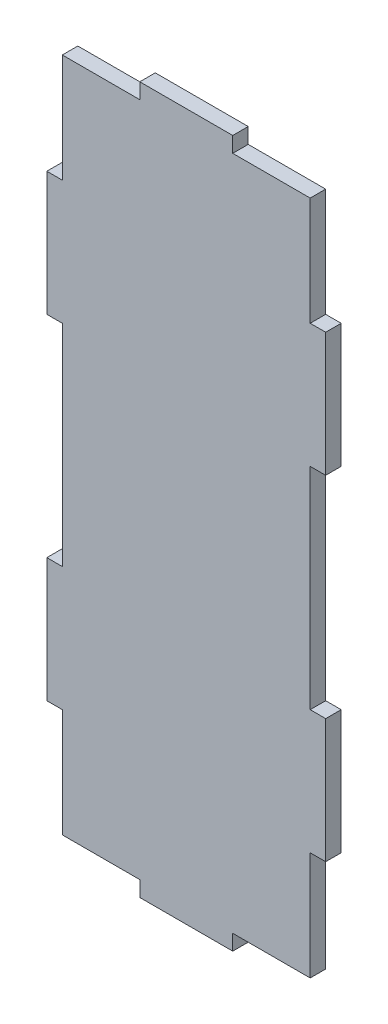
ISO-10303-21;
HEADER;
FILE_DESCRIPTION(('STEP AP214'),'2;1');
FILE_NAME('part.step','',(''),(''),'','','');
FILE_SCHEMA(('AUTOMOTIVE_DESIGN { 1 0 10303 214 1 1 1 1 }'));
ENDSEC;
DATA;
#1=APPLICATION_CONTEXT('core data for automotive mechanical design processes');
#2=APPLICATION_PROTOCOL_DEFINITION('international standard','automotive_design',2000,#1);
#3=PRODUCT_CONTEXT('',#1,'mechanical');
#4=PRODUCT('Part','Part','',(#3));
#5=PRODUCT_RELATED_PRODUCT_CATEGORY('part','',(#4));
#6=PRODUCT_DEFINITION_FORMATION('','',#4);
#7=PRODUCT_DEFINITION_CONTEXT('part definition',#1,'design');
#8=PRODUCT_DEFINITION('design','',#6,#7);
#9=PRODUCT_DEFINITION_SHAPE('','',#8);
#10=(LENGTH_UNIT() NAMED_UNIT(*) SI_UNIT(.MILLI.,.METRE.));
#11=(NAMED_UNIT(*) PLANE_ANGLE_UNIT() SI_UNIT($,.RADIAN.));
#12=(NAMED_UNIT(*) SI_UNIT($,.STERADIAN.) SOLID_ANGLE_UNIT());
#13=UNCERTAINTY_MEASURE_WITH_UNIT(LENGTH_MEASURE(1.E-05),#10,'distance_accuracy_value','');
#14=(GEOMETRIC_REPRESENTATION_CONTEXT(3) GLOBAL_UNCERTAINTY_ASSIGNED_CONTEXT((#13)) GLOBAL_UNIT_ASSIGNED_CONTEXT((#10,
#11,#12)) REPRESENTATION_CONTEXT('',''));
#15=CARTESIAN_POINT('',(0.,0.,0.));
#16=DIRECTION('',(0.,0.,1.));
#17=DIRECTION('',(1.,0.,0.));
#18=AXIS2_PLACEMENT_3D('',#15,#16,#17);
#19=CARTESIAN_POINT('',(0.,0.,3.175));
#20=DIRECTION('',(1.,0.,0.));
#21=DIRECTION('',(0.,0.,-1.));
#22=AXIS2_PLACEMENT_3D('',#19,#20,#21);
#23=PLANE('',#22);
#24=DIRECTION('',(0.,-1.,0.));
#25=VECTOR('',#24,1.);
#26=CARTESIAN_POINT('',(0.,0.,0.));
#27=LINE('',#26,#25);
#28=CARTESIAN_POINT('',(0.,22.225,0.));
#29=VERTEX_POINT('',#28);
#30=CARTESIAN_POINT('',(0.,0.,0.));
#31=VERTEX_POINT('',#30);
#32=EDGE_CURVE('E249',#29,#31,#27,.T.);
#33=ORIENTED_EDGE('',*,*,#32,.T.);
#34=DIRECTION('',(0.,0.,-1.));
#35=VECTOR('',#34,1.);
#36=CARTESIAN_POINT('',(0.,0.,3.175));
#37=LINE('',#36,#35);
#38=CARTESIAN_POINT('',(0.,0.,3.175));
#39=VERTEX_POINT('',#38);
#40=EDGE_CURVE('E11',#39,#31,#37,.T.);
#41=ORIENTED_EDGE('',*,*,#40,.F.);
#42=DIRECTION('',(0.,-1.,0.));
#43=VECTOR('',#42,1.);
#44=CARTESIAN_POINT('',(0.,0.,3.175));
#45=LINE('',#44,#43);
#46=CARTESIAN_POINT('',(0.,22.225,3.175));
#47=VERTEX_POINT('',#46);
#48=EDGE_CURVE('E303',#47,#39,#45,.T.);
#49=ORIENTED_EDGE('',*,*,#48,.F.);
#50=DIRECTION('',(0.,0.,-1.));
#51=VECTOR('',#50,1.);
#52=CARTESIAN_POINT('',(0.,22.225,3.175));
#53=LINE('',#52,#51);
#54=EDGE_CURVE('E245',#47,#29,#53,.T.);
#55=ORIENTED_EDGE('',*,*,#54,.T.);
#56=EDGE_LOOP('',(#33,#41,#49,#55));
#57=FACE_BOUND('',#56,.T.);
#58=ADVANCED_FACE('F33',(#57),#23,.F.);
#59=CARTESIAN_POINT('',(0.,0.,3.175));
#60=DIRECTION('',(0.,1.,0.));
#61=DIRECTION('',(-1.,0.,0.));
#62=AXIS2_PLACEMENT_3D('',#59,#60,#61);
#63=PLANE('',#62);
#64=DIRECTION('',(1.,0.,0.));
#65=VECTOR('',#64,1.);
#66=CARTESIAN_POINT('',(0.,0.,0.));
#67=LINE('',#66,#65);
#68=CARTESIAN_POINT('',(15.8750000000001,0.,0.));
#69=VERTEX_POINT('',#68);
#70=EDGE_CURVE('E252',#31,#69,#67,.T.);
#71=ORIENTED_EDGE('',*,*,#70,.T.);
#72=DIRECTION('',(0.,0.,-1.));
#73=VECTOR('',#72,1.);
#74=CARTESIAN_POINT('',(15.8750000000001,0.,3.175));
#75=LINE('',#74,#73);
#76=CARTESIAN_POINT('',(15.8750000000001,0.,3.175));
#77=VERTEX_POINT('',#76);
#78=EDGE_CURVE('E41',#77,#69,#75,.T.);
#79=ORIENTED_EDGE('',*,*,#78,.F.);
#80=DIRECTION('',(1.,0.,0.));
#81=VECTOR('',#80,1.);
#82=CARTESIAN_POINT('',(0.,0.,3.175));
#83=LINE('',#82,#81);
#84=EDGE_CURVE('E152',#39,#77,#83,.T.);
#85=ORIENTED_EDGE('',*,*,#84,.F.);
#86=ORIENTED_EDGE('',*,*,#40,.T.);
#87=EDGE_LOOP('',(#71,#79,#85,#86));
#88=FACE_BOUND('',#87,.T.);
#89=ADVANCED_FACE('F461',(#88),#63,.F.);
#90=CARTESIAN_POINT('',(15.8750000000001,0.,3.175));
#91=DIRECTION('',(1.,0.,0.));
#92=DIRECTION('',(0.,0.,-1.));
#93=AXIS2_PLACEMENT_3D('',#90,#91,#92);
#94=PLANE('',#93);
#95=DIRECTION('',(0.,-1.,0.));
#96=VECTOR('',#95,1.);
#97=CARTESIAN_POINT('',(15.8750000000001,0.,0.));
#98=LINE('',#97,#96);
#99=CARTESIAN_POINT('',(15.8750000000001,-3.17500000000004,0.));
#100=VERTEX_POINT('',#99);
#101=EDGE_CURVE('E254',#69,#100,#98,.T.);
#102=ORIENTED_EDGE('',*,*,#101,.T.);
#103=DIRECTION('',(0.,0.,-1.));
#104=VECTOR('',#103,1.);
#105=CARTESIAN_POINT('',(15.8750000000001,-3.17500000000004,3.175));
#106=LINE('',#105,#104);
#107=CARTESIAN_POINT('',(15.8750000000001,-3.17500000000004,3.175));
#108=VERTEX_POINT('',#107);
#109=EDGE_CURVE('E370',#108,#100,#106,.T.);
#110=ORIENTED_EDGE('',*,*,#109,.F.);
#111=DIRECTION('',(0.,-1.,0.));
#112=VECTOR('',#111,1.);
#113=CARTESIAN_POINT('',(15.8750000000001,0.,3.175));
#114=LINE('',#113,#112);
#115=EDGE_CURVE('E378',#77,#108,#114,.T.);
#116=ORIENTED_EDGE('',*,*,#115,.F.);
#117=ORIENTED_EDGE('',*,*,#78,.T.);
#118=EDGE_LOOP('',(#102,#110,#116,#117));
#119=FACE_BOUND('',#118,.T.);
#120=ADVANCED_FACE('F376',(#119),#94,.F.);
#121=CARTESIAN_POINT('',(15.8750000000001,-3.17500000000004,3.175));
#122=DIRECTION('',(0.,1.,0.));
#123=DIRECTION('',(-1.,0.,0.));
#124=AXIS2_PLACEMENT_3D('',#121,#122,#123);
#125=PLANE('',#124);
#126=DIRECTION('',(1.,0.,0.));
#127=VECTOR('',#126,1.);
#128=CARTESIAN_POINT('',(15.8750000000001,-3.17500000000004,0.));
#129=LINE('',#128,#127);
#130=CARTESIAN_POINT('',(34.9250000000001,-3.17500000000001,0.));
#131=VERTEX_POINT('',#130);
#132=EDGE_CURVE('E256',#100,#131,#129,.T.);
#133=ORIENTED_EDGE('',*,*,#132,.T.);
#134=DIRECTION('',(0.,0.,-1.));
#135=VECTOR('',#134,1.);
#136=CARTESIAN_POINT('',(34.9250000000001,-3.17500000000001,3.175));
#137=LINE('',#136,#135);
#138=CARTESIAN_POINT('',(34.9250000000001,-3.17500000000001,3.175));
#139=VERTEX_POINT('',#138);
#140=EDGE_CURVE('E367',#139,#131,#137,.T.);
#141=ORIENTED_EDGE('',*,*,#140,.F.);
#142=DIRECTION('',(1.,0.,0.));
#143=VECTOR('',#142,1.);
#144=CARTESIAN_POINT('',(15.8750000000001,-3.17500000000004,3.175));
#145=LINE('',#144,#143);
#146=EDGE_CURVE('E396',#108,#139,#145,.T.);
#147=ORIENTED_EDGE('',*,*,#146,.F.);
#148=ORIENTED_EDGE('',*,*,#109,.T.);
#149=EDGE_LOOP('',(#133,#141,#147,#148));
#150=FACE_BOUND('',#149,.T.);
#151=ADVANCED_FACE('F387',(#150),#125,.F.);
#152=CARTESIAN_POINT('',(34.9250000000001,-3.17500000000001,3.175));
#153=DIRECTION('',(-1.,0.,0.));
#154=DIRECTION('',(0.,0.,1.));
#155=AXIS2_PLACEMENT_3D('',#152,#153,#154);
#156=PLANE('',#155);
#157=DIRECTION('',(0.,1.,0.));
#158=VECTOR('',#157,1.);
#159=CARTESIAN_POINT('',(34.9250000000001,-3.17500000000001,0.));
#160=LINE('',#159,#158);
#161=CARTESIAN_POINT('',(34.9250000000001,0.,0.));
#162=VERTEX_POINT('',#161);
#163=EDGE_CURVE('E258',#131,#162,#160,.T.);
#164=ORIENTED_EDGE('',*,*,#163,.T.);
#165=DIRECTION('',(0.,0.,-1.));
#166=VECTOR('',#165,1.);
#167=CARTESIAN_POINT('',(34.9250000000001,0.,3.175));
#168=LINE('',#167,#166);
#169=CARTESIAN_POINT('',(34.9250000000001,0.,3.175));
#170=VERTEX_POINT('',#169);
#171=EDGE_CURVE('E364',#170,#162,#168,.T.);
#172=ORIENTED_EDGE('',*,*,#171,.F.);
#173=DIRECTION('',(0.,1.,0.));
#174=VECTOR('',#173,1.);
#175=CARTESIAN_POINT('',(34.9250000000001,-3.17500000000001,3.175));
#176=LINE('',#175,#174);
#177=EDGE_CURVE('E393',#139,#170,#176,.T.);
#178=ORIENTED_EDGE('',*,*,#177,.F.);
#179=ORIENTED_EDGE('',*,*,#140,.T.);
#180=EDGE_LOOP('',(#164,#172,#178,#179));
#181=FACE_BOUND('',#180,.T.);
#182=ADVANCED_FACE('F391',(#181),#156,.F.);
#183=CARTESIAN_POINT('',(34.9250000000001,0.,3.175));
#184=DIRECTION('',(0.,1.,0.));
#185=DIRECTION('',(0.,0.,1.));
#186=AXIS2_PLACEMENT_3D('',#183,#184,#185);
#187=PLANE('',#186);
#188=DIRECTION('',(1.,0.,0.));
#189=VECTOR('',#188,1.);
#190=CARTESIAN_POINT('',(34.9250000000001,0.,0.));
#191=LINE('',#190,#189);
#192=CARTESIAN_POINT('',(50.8,0.,0.));
#193=VERTEX_POINT('',#192);
#194=EDGE_CURVE('E260',#162,#193,#191,.T.);
#195=ORIENTED_EDGE('',*,*,#194,.T.);
#196=DIRECTION('',(0.,0.,-1.));
#197=VECTOR('',#196,1.);
#198=CARTESIAN_POINT('',(50.8,0.,3.175));
#199=LINE('',#198,#197);
#200=CARTESIAN_POINT('',(50.8,0.,3.175));
#201=VERTEX_POINT('',#200);
#202=EDGE_CURVE('E361',#201,#193,#199,.T.);
#203=ORIENTED_EDGE('',*,*,#202,.F.);
#204=DIRECTION('',(1.,0.,0.));
#205=VECTOR('',#204,1.);
#206=CARTESIAN_POINT('',(34.9250000000001,0.,3.175));
#207=LINE('',#206,#205);
#208=EDGE_CURVE('E395',#170,#201,#207,.T.);
#209=ORIENTED_EDGE('',*,*,#208,.F.);
#210=ORIENTED_EDGE('',*,*,#171,.T.);
#211=EDGE_LOOP('',(#195,#203,#209,#210));
#212=FACE_BOUND('',#211,.T.);
#213=ADVANCED_FACE('F474',(#212),#187,.F.);
#214=CARTESIAN_POINT('',(50.8,0.,3.175));
#215=DIRECTION('',(-1.,0.,0.));
#216=DIRECTION('',(0.,0.,1.));
#217=AXIS2_PLACEMENT_3D('',#214,#215,#216);
#218=PLANE('',#217);
#219=DIRECTION('',(0.,1.,0.));
#220=VECTOR('',#219,1.);
#221=CARTESIAN_POINT('',(50.8,0.,0.));
#222=LINE('',#221,#220);
#223=CARTESIAN_POINT('',(50.8,22.225,0.));
#224=VERTEX_POINT('',#223);
#225=EDGE_CURVE('E262',#193,#224,#222,.T.);
#226=ORIENTED_EDGE('',*,*,#225,.T.);
#227=DIRECTION('',(0.,0.,-1.));
#228=VECTOR('',#227,1.);
#229=CARTESIAN_POINT('',(50.8,22.225,3.175));
#230=LINE('',#229,#228);
#231=CARTESIAN_POINT('',(50.8,22.225,3.175));
#232=VERTEX_POINT('',#231);
#233=EDGE_CURVE('E358',#232,#224,#230,.T.);
#234=ORIENTED_EDGE('',*,*,#233,.F.);
#235=DIRECTION('',(0.,1.,0.));
#236=VECTOR('',#235,1.);
#237=CARTESIAN_POINT('',(50.8,0.,3.175));
#238=LINE('',#237,#236);
#239=EDGE_CURVE('E398',#201,#232,#238,.T.);
#240=ORIENTED_EDGE('',*,*,#239,.F.);
#241=ORIENTED_EDGE('',*,*,#202,.T.);
#242=EDGE_LOOP('',(#226,#234,#240,#241));
#243=FACE_BOUND('',#242,.T.);
#244=ADVANCED_FACE('F477',(#243),#218,.F.);
#245=CARTESIAN_POINT('',(50.8,22.225,3.175));
#246=DIRECTION('',(0.,1.,0.));
#247=DIRECTION('',(0.,0.,1.));
#248=AXIS2_PLACEMENT_3D('',#245,#246,#247);
#249=PLANE('',#248);
#250=DIRECTION('',(1.,0.,0.));
#251=VECTOR('',#250,1.);
#252=CARTESIAN_POINT('',(50.8,22.225,0.));
#253=LINE('',#252,#251);
#254=CARTESIAN_POINT('',(53.975,22.225,0.));
#255=VERTEX_POINT('',#254);
#256=EDGE_CURVE('E264',#224,#255,#253,.T.);
#257=ORIENTED_EDGE('',*,*,#256,.T.);
#258=DIRECTION('',(0.,0.,-1.));
#259=VECTOR('',#258,1.);
#260=CARTESIAN_POINT('',(53.975,22.225,3.175));
#261=LINE('',#260,#259);
#262=CARTESIAN_POINT('',(53.975,22.225,3.175));
#263=VERTEX_POINT('',#262);
#264=EDGE_CURVE('E355',#263,#255,#261,.T.);
#265=ORIENTED_EDGE('',*,*,#264,.F.);
#266=DIRECTION('',(1.,0.,0.));
#267=VECTOR('',#266,1.);
#268=CARTESIAN_POINT('',(50.8,22.225,3.175));
#269=LINE('',#268,#267);
#270=EDGE_CURVE('E404',#232,#263,#269,.T.);
#271=ORIENTED_EDGE('',*,*,#270,.F.);
#272=ORIENTED_EDGE('',*,*,#233,.T.);
#273=EDGE_LOOP('',(#257,#265,#271,#272));
#274=FACE_BOUND('',#273,.T.);
#275=ADVANCED_FACE('F481',(#274),#249,.F.);
#276=CARTESIAN_POINT('',(53.975,22.225,3.175));
#277=DIRECTION('',(-1.,0.,0.));
#278=DIRECTION('',(0.,-1.,0.));
#279=AXIS2_PLACEMENT_3D('',#276,#277,#278);
#280=PLANE('',#279);
#281=DIRECTION('',(0.,1.,0.));
#282=VECTOR('',#281,1.);
#283=CARTESIAN_POINT('',(53.975,22.225,0.));
#284=LINE('',#283,#282);
#285=CARTESIAN_POINT('',(53.975,47.625,0.));
#286=VERTEX_POINT('',#285);
#287=EDGE_CURVE('E266',#255,#286,#284,.T.);
#288=ORIENTED_EDGE('',*,*,#287,.T.);
#289=DIRECTION('',(0.,0.,-1.));
#290=VECTOR('',#289,1.);
#291=CARTESIAN_POINT('',(53.975,47.625,3.175));
#292=LINE('',#291,#290);
#293=CARTESIAN_POINT('',(53.975,47.625,3.175));
#294=VERTEX_POINT('',#293);
#295=EDGE_CURVE('E352',#294,#286,#292,.T.);
#296=ORIENTED_EDGE('',*,*,#295,.F.);
#297=DIRECTION('',(0.,1.,0.));
#298=VECTOR('',#297,1.);
#299=CARTESIAN_POINT('',(53.975,22.225,3.175));
#300=LINE('',#299,#298);
#301=EDGE_CURVE('E406',#263,#294,#300,.T.);
#302=ORIENTED_EDGE('',*,*,#301,.F.);
#303=ORIENTED_EDGE('',*,*,#264,.T.);
#304=EDGE_LOOP('',(#288,#296,#302,#303));
#305=FACE_BOUND('',#304,.T.);
#306=ADVANCED_FACE('F485',(#305),#280,.F.);
#307=CARTESIAN_POINT('',(53.975,47.625,3.175));
#308=DIRECTION('',(0.,-1.,0.));
#309=DIRECTION('',(0.,0.,-1.));
#310=AXIS2_PLACEMENT_3D('',#307,#308,#309);
#311=PLANE('',#310);
#312=DIRECTION('',(-1.,0.,0.));
#313=VECTOR('',#312,1.);
#314=CARTESIAN_POINT('',(53.975,47.625,0.));
#315=LINE('',#314,#313);
#316=CARTESIAN_POINT('',(50.8,47.625,0.));
#317=VERTEX_POINT('',#316);
#318=EDGE_CURVE('E268',#286,#317,#315,.T.);
#319=ORIENTED_EDGE('',*,*,#318,.T.);
#320=DIRECTION('',(0.,0.,-1.));
#321=VECTOR('',#320,1.);
#322=CARTESIAN_POINT('',(50.8,47.625,3.175));
#323=LINE('',#322,#321);
#324=CARTESIAN_POINT('',(50.8,47.625,3.175));
#325=VERTEX_POINT('',#324);
#326=EDGE_CURVE('E349',#325,#317,#323,.T.);
#327=ORIENTED_EDGE('',*,*,#326,.F.);
#328=DIRECTION('',(-1.,0.,0.));
#329=VECTOR('',#328,1.);
#330=CARTESIAN_POINT('',(53.975,47.625,3.175));
#331=LINE('',#330,#329);
#332=EDGE_CURVE('E408',#294,#325,#331,.T.);
#333=ORIENTED_EDGE('',*,*,#332,.F.);
#334=ORIENTED_EDGE('',*,*,#295,.T.);
#335=EDGE_LOOP('',(#319,#327,#333,#334));
#336=FACE_BOUND('',#335,.T.);
#337=ADVANCED_FACE('F489',(#336),#311,.F.);
#338=CARTESIAN_POINT('',(50.8,47.625,3.175));
#339=DIRECTION('',(-1.,0.,0.));
#340=DIRECTION('',(0.,0.,1.));
#341=AXIS2_PLACEMENT_3D('',#338,#339,#340);
#342=PLANE('',#341);
#343=DIRECTION('',(0.,1.,0.));
#344=VECTOR('',#343,1.);
#345=CARTESIAN_POINT('',(50.8,47.625,0.));
#346=LINE('',#345,#344);
#347=CARTESIAN_POINT('',(50.8,90.805,0.));
#348=VERTEX_POINT('',#347);
#349=EDGE_CURVE('E270',#317,#348,#346,.T.);
#350=ORIENTED_EDGE('',*,*,#349,.T.);
#351=DIRECTION('',(0.,0.,-1.));
#352=VECTOR('',#351,1.);
#353=CARTESIAN_POINT('',(50.8,90.805,3.175));
#354=LINE('',#353,#352);
#355=CARTESIAN_POINT('',(50.8,90.805,3.175));
#356=VERTEX_POINT('',#355);
#357=EDGE_CURVE('E346',#356,#348,#354,.T.);
#358=ORIENTED_EDGE('',*,*,#357,.F.);
#359=DIRECTION('',(0.,1.,0.));
#360=VECTOR('',#359,1.);
#361=CARTESIAN_POINT('',(50.8,47.625,3.175));
#362=LINE('',#361,#360);
#363=EDGE_CURVE('E410',#325,#356,#362,.T.);
#364=ORIENTED_EDGE('',*,*,#363,.F.);
#365=ORIENTED_EDGE('',*,*,#326,.T.);
#366=EDGE_LOOP('',(#350,#358,#364,#365));
#367=FACE_BOUND('',#366,.T.);
#368=ADVANCED_FACE('F493',(#367),#342,.F.);
#369=CARTESIAN_POINT('',(53.975,90.805,3.175));
#370=DIRECTION('',(0.,1.,0.));
#371=DIRECTION('',(0.,0.,1.));
#372=AXIS2_PLACEMENT_3D('',#369,#370,#371);
#373=PLANE('',#372);
#374=DIRECTION('',(1.,0.,0.));
#375=VECTOR('',#374,1.);
#376=CARTESIAN_POINT('',(53.975,90.805,0.));
#377=LINE('',#376,#375);
#378=CARTESIAN_POINT('',(53.975,90.805,0.));
#379=VERTEX_POINT('',#378);
#380=EDGE_CURVE('E272',#348,#379,#377,.T.);
#381=ORIENTED_EDGE('',*,*,#380,.T.);
#382=DIRECTION('',(0.,0.,-1.));
#383=VECTOR('',#382,1.);
#384=CARTESIAN_POINT('',(53.975,90.805,3.175));
#385=LINE('',#384,#383);
#386=CARTESIAN_POINT('',(53.975,90.805,3.175));
#387=VERTEX_POINT('',#386);
#388=EDGE_CURVE('E343',#387,#379,#385,.T.);
#389=ORIENTED_EDGE('',*,*,#388,.F.);
#390=DIRECTION('',(1.,0.,0.));
#391=VECTOR('',#390,1.);
#392=CARTESIAN_POINT('',(53.975,90.805,3.175));
#393=LINE('',#392,#391);
#394=EDGE_CURVE('E412',#356,#387,#393,.T.);
#395=ORIENTED_EDGE('',*,*,#394,.F.);
#396=ORIENTED_EDGE('',*,*,#357,.T.);
#397=EDGE_LOOP('',(#381,#389,#395,#396));
#398=FACE_BOUND('',#397,.T.);
#399=ADVANCED_FACE('F497',(#398),#373,.F.);
#400=CARTESIAN_POINT('',(53.975,116.205,3.175));
#401=DIRECTION('',(-1.,0.,0.));
#402=DIRECTION('',(0.,-1.,0.));
#403=AXIS2_PLACEMENT_3D('',#400,#401,#402);
#404=PLANE('',#403);
#405=DIRECTION('',(0.,1.,0.));
#406=VECTOR('',#405,1.);
#407=CARTESIAN_POINT('',(53.975,116.205,0.));
#408=LINE('',#407,#406);
#409=CARTESIAN_POINT('',(53.975,116.205,0.));
#410=VERTEX_POINT('',#409);
#411=EDGE_CURVE('E274',#379,#410,#408,.T.);
#412=ORIENTED_EDGE('',*,*,#411,.T.);
#413=DIRECTION('',(0.,0.,-1.));
#414=VECTOR('',#413,1.);
#415=CARTESIAN_POINT('',(53.975,116.205,3.175));
#416=LINE('',#415,#414);
#417=CARTESIAN_POINT('',(53.975,116.205,3.175));
#418=VERTEX_POINT('',#417);
#419=EDGE_CURVE('E340',#418,#410,#416,.T.);
#420=ORIENTED_EDGE('',*,*,#419,.F.);
#421=DIRECTION('',(0.,1.,0.));
#422=VECTOR('',#421,1.);
#423=CARTESIAN_POINT('',(53.975,116.205,3.175));
#424=LINE('',#423,#422);
#425=EDGE_CURVE('E414',#387,#418,#424,.T.);
#426=ORIENTED_EDGE('',*,*,#425,.F.);
#427=ORIENTED_EDGE('',*,*,#388,.T.);
#428=EDGE_LOOP('',(#412,#420,#426,#427));
#429=FACE_BOUND('',#428,.T.);
#430=ADVANCED_FACE('F501',(#429),#404,.F.);
#431=CARTESIAN_POINT('',(50.8,116.205,3.175));
#432=DIRECTION('',(0.,-1.,0.));
#433=DIRECTION('',(0.,0.,-1.));
#434=AXIS2_PLACEMENT_3D('',#431,#432,#433);
#435=PLANE('',#434);
#436=DIRECTION('',(-1.,0.,0.));
#437=VECTOR('',#436,1.);
#438=CARTESIAN_POINT('',(50.8,116.205,0.));
#439=LINE('',#438,#437);
#440=CARTESIAN_POINT('',(50.8,116.205,0.));
#441=VERTEX_POINT('',#440);
#442=EDGE_CURVE('E276',#410,#441,#439,.T.);
#443=ORIENTED_EDGE('',*,*,#442,.T.);
#444=DIRECTION('',(0.,0.,-1.));
#445=VECTOR('',#444,1.);
#446=CARTESIAN_POINT('',(50.8,116.205,3.175));
#447=LINE('',#446,#445);
#448=CARTESIAN_POINT('',(50.8,116.205,3.175));
#449=VERTEX_POINT('',#448);
#450=EDGE_CURVE('E337',#449,#441,#447,.T.);
#451=ORIENTED_EDGE('',*,*,#450,.F.);
#452=DIRECTION('',(-1.,0.,0.));
#453=VECTOR('',#452,1.);
#454=CARTESIAN_POINT('',(50.8,116.205,3.175));
#455=LINE('',#454,#453);
#456=EDGE_CURVE('E416',#418,#449,#455,.T.);
#457=ORIENTED_EDGE('',*,*,#456,.F.);
#458=ORIENTED_EDGE('',*,*,#419,.T.);
#459=EDGE_LOOP('',(#443,#451,#457,#458));
#460=FACE_BOUND('',#459,.T.);
#461=ADVANCED_FACE('F505',(#460),#435,.F.);
#462=CARTESIAN_POINT('',(50.8,116.205,3.175));
#463=DIRECTION('',(-1.,0.,0.));
#464=DIRECTION('',(0.,0.,1.));
#465=AXIS2_PLACEMENT_3D('',#462,#463,#464);
#466=PLANE('',#465);
#467=DIRECTION('',(0.,1.,0.));
#468=VECTOR('',#467,1.);
#469=CARTESIAN_POINT('',(50.8,116.205,0.));
#470=LINE('',#469,#468);
#471=CARTESIAN_POINT('',(50.8,138.43,0.));
#472=VERTEX_POINT('',#471);
#473=EDGE_CURVE('E278',#441,#472,#470,.T.);
#474=ORIENTED_EDGE('',*,*,#473,.T.);
#475=DIRECTION('',(0.,0.,-1.));
#476=VECTOR('',#475,1.);
#477=CARTESIAN_POINT('',(50.8,138.43,3.175));
#478=LINE('',#477,#476);
#479=CARTESIAN_POINT('',(50.8,138.43,3.175));
#480=VERTEX_POINT('',#479);
#481=EDGE_CURVE('E334',#480,#472,#478,.T.);
#482=ORIENTED_EDGE('',*,*,#481,.F.);
#483=DIRECTION('',(0.,1.,0.));
#484=VECTOR('',#483,1.);
#485=CARTESIAN_POINT('',(50.8,116.205,3.175));
#486=LINE('',#485,#484);
#487=EDGE_CURVE('E418',#449,#480,#486,.T.);
#488=ORIENTED_EDGE('',*,*,#487,.F.);
#489=ORIENTED_EDGE('',*,*,#450,.T.);
#490=EDGE_LOOP('',(#474,#482,#488,#489));
#491=FACE_BOUND('',#490,.T.);
#492=ADVANCED_FACE('F509',(#491),#466,.F.);
#493=CARTESIAN_POINT('',(34.925,138.43,3.175));
#494=DIRECTION('',(0.,-1.,0.));
#495=DIRECTION('',(0.,0.,-1.));
#496=AXIS2_PLACEMENT_3D('',#493,#494,#495);
#497=PLANE('',#496);
#498=DIRECTION('',(-1.,0.,0.));
#499=VECTOR('',#498,1.);
#500=CARTESIAN_POINT('',(34.925,138.43,0.));
#501=LINE('',#500,#499);
#502=CARTESIAN_POINT('',(34.925,138.43,0.));
#503=VERTEX_POINT('',#502);
#504=EDGE_CURVE('E280',#472,#503,#501,.T.);
#505=ORIENTED_EDGE('',*,*,#504,.T.);
#506=DIRECTION('',(0.,0.,-1.));
#507=VECTOR('',#506,1.);
#508=CARTESIAN_POINT('',(34.925,138.43,3.175));
#509=LINE('',#508,#507);
#510=CARTESIAN_POINT('',(34.925,138.43,3.175));
#511=VERTEX_POINT('',#510);
#512=EDGE_CURVE('E331',#511,#503,#509,.T.);
#513=ORIENTED_EDGE('',*,*,#512,.F.);
#514=DIRECTION('',(-1.,0.,0.));
#515=VECTOR('',#514,1.);
#516=CARTESIAN_POINT('',(34.925,138.43,3.175));
#517=LINE('',#516,#515);
#518=EDGE_CURVE('E420',#480,#511,#517,.T.);
#519=ORIENTED_EDGE('',*,*,#518,.F.);
#520=ORIENTED_EDGE('',*,*,#481,.T.);
#521=EDGE_LOOP('',(#505,#513,#519,#520));
#522=FACE_BOUND('',#521,.T.);
#523=ADVANCED_FACE('F513',(#522),#497,.F.);
#524=CARTESIAN_POINT('',(34.925,141.605,3.175));
#525=DIRECTION('',(-1.,0.,0.));
#526=DIRECTION('',(0.,0.,1.));
#527=AXIS2_PLACEMENT_3D('',#524,#525,#526);
#528=PLANE('',#527);
#529=DIRECTION('',(0.,1.,0.));
#530=VECTOR('',#529,1.);
#531=CARTESIAN_POINT('',(34.925,141.605,0.));
#532=LINE('',#531,#530);
#533=CARTESIAN_POINT('',(34.925,141.605,0.));
#534=VERTEX_POINT('',#533);
#535=EDGE_CURVE('E282',#503,#534,#532,.T.);
#536=ORIENTED_EDGE('',*,*,#535,.T.);
#537=DIRECTION('',(0.,0.,-1.));
#538=VECTOR('',#537,1.);
#539=CARTESIAN_POINT('',(34.925,141.605,3.175));
#540=LINE('',#539,#538);
#541=CARTESIAN_POINT('',(34.925,141.605,3.175));
#542=VERTEX_POINT('',#541);
#543=EDGE_CURVE('E328',#542,#534,#540,.T.);
#544=ORIENTED_EDGE('',*,*,#543,.F.);
#545=DIRECTION('',(0.,1.,0.));
#546=VECTOR('',#545,1.);
#547=CARTESIAN_POINT('',(34.925,141.605,3.175));
#548=LINE('',#547,#546);
#549=EDGE_CURVE('E422',#511,#542,#548,.T.);
#550=ORIENTED_EDGE('',*,*,#549,.F.);
#551=ORIENTED_EDGE('',*,*,#512,.T.);
#552=EDGE_LOOP('',(#536,#544,#550,#551));
#553=FACE_BOUND('',#552,.T.);
#554=ADVANCED_FACE('F517',(#553),#528,.F.);
#555=CARTESIAN_POINT('',(15.875,141.605,3.175));
#556=DIRECTION('',(0.,-1.,0.));
#557=DIRECTION('',(0.,0.,-1.));
#558=AXIS2_PLACEMENT_3D('',#555,#556,#557);
#559=PLANE('',#558);
#560=DIRECTION('',(-1.,0.,0.));
#561=VECTOR('',#560,1.);
#562=CARTESIAN_POINT('',(15.875,141.605,0.));
#563=LINE('',#562,#561);
#564=CARTESIAN_POINT('',(15.875,141.605,0.));
#565=VERTEX_POINT('',#564);
#566=EDGE_CURVE('E284',#534,#565,#563,.T.);
#567=ORIENTED_EDGE('',*,*,#566,.T.);
#568=DIRECTION('',(0.,0.,-1.));
#569=VECTOR('',#568,1.);
#570=CARTESIAN_POINT('',(15.875,141.605,3.175));
#571=LINE('',#570,#569);
#572=CARTESIAN_POINT('',(15.875,141.605,3.175));
#573=VERTEX_POINT('',#572);
#574=EDGE_CURVE('E325',#573,#565,#571,.T.);
#575=ORIENTED_EDGE('',*,*,#574,.F.);
#576=DIRECTION('',(-1.,0.,0.));
#577=VECTOR('',#576,1.);
#578=CARTESIAN_POINT('',(15.875,141.605,3.175));
#579=LINE('',#578,#577);
#580=EDGE_CURVE('E424',#542,#573,#579,.T.);
#581=ORIENTED_EDGE('',*,*,#580,.F.);
#582=ORIENTED_EDGE('',*,*,#543,.T.);
#583=EDGE_LOOP('',(#567,#575,#581,#582));
#584=FACE_BOUND('',#583,.T.);
#585=ADVANCED_FACE('F521',(#584),#559,.F.);
#586=CARTESIAN_POINT('',(15.875,138.43,3.175));
#587=DIRECTION('',(1.,0.,0.));
#588=DIRECTION('',(0.,1.,0.));
#589=AXIS2_PLACEMENT_3D('',#586,#587,#588);
#590=PLANE('',#589);
#591=DIRECTION('',(0.,-1.,0.));
#592=VECTOR('',#591,1.);
#593=CARTESIAN_POINT('',(15.875,138.43,0.));
#594=LINE('',#593,#592);
#595=CARTESIAN_POINT('',(15.875,138.43,0.));
#596=VERTEX_POINT('',#595);
#597=EDGE_CURVE('E286',#565,#596,#594,.T.);
#598=ORIENTED_EDGE('',*,*,#597,.T.);
#599=DIRECTION('',(0.,0.,-1.));
#600=VECTOR('',#599,1.);
#601=CARTESIAN_POINT('',(15.875,138.43,3.175));
#602=LINE('',#601,#600);
#603=CARTESIAN_POINT('',(15.875,138.43,3.175));
#604=VERTEX_POINT('',#603);
#605=EDGE_CURVE('E322',#604,#596,#602,.T.);
#606=ORIENTED_EDGE('',*,*,#605,.F.);
#607=DIRECTION('',(0.,-1.,0.));
#608=VECTOR('',#607,1.);
#609=CARTESIAN_POINT('',(15.875,138.43,3.175));
#610=LINE('',#609,#608);
#611=EDGE_CURVE('E426',#573,#604,#610,.T.);
#612=ORIENTED_EDGE('',*,*,#611,.F.);
#613=ORIENTED_EDGE('',*,*,#574,.T.);
#614=EDGE_LOOP('',(#598,#606,#612,#613));
#615=FACE_BOUND('',#614,.T.);
#616=ADVANCED_FACE('F525',(#615),#590,.F.);
#617=CARTESIAN_POINT('',(0.,138.43,3.175));
#618=DIRECTION('',(0.,-1.,0.));
#619=DIRECTION('',(0.,0.,-1.));
#620=AXIS2_PLACEMENT_3D('',#617,#618,#619);
#621=PLANE('',#620);
#622=DIRECTION('',(-1.,0.,0.));
#623=VECTOR('',#622,1.);
#624=CARTESIAN_POINT('',(0.,138.43,0.));
#625=LINE('',#624,#623);
#626=CARTESIAN_POINT('',(0.,138.43,0.));
#627=VERTEX_POINT('',#626);
#628=EDGE_CURVE('E288',#596,#627,#625,.T.);
#629=ORIENTED_EDGE('',*,*,#628,.T.);
#630=DIRECTION('',(0.,0.,-1.));
#631=VECTOR('',#630,1.);
#632=CARTESIAN_POINT('',(0.,138.43,3.175));
#633=LINE('',#632,#631);
#634=CARTESIAN_POINT('',(0.,138.43,3.175));
#635=VERTEX_POINT('',#634);
#636=EDGE_CURVE('E319',#635,#627,#633,.T.);
#637=ORIENTED_EDGE('',*,*,#636,.F.);
#638=DIRECTION('',(-1.,0.,0.));
#639=VECTOR('',#638,1.);
#640=CARTESIAN_POINT('',(0.,138.43,3.175));
#641=LINE('',#640,#639);
#642=EDGE_CURVE('E428',#604,#635,#641,.T.);
#643=ORIENTED_EDGE('',*,*,#642,.F.);
#644=ORIENTED_EDGE('',*,*,#605,.T.);
#645=EDGE_LOOP('',(#629,#637,#643,#644));
#646=FACE_BOUND('',#645,.T.);
#647=ADVANCED_FACE('F529',(#646),#621,.F.);
#648=CARTESIAN_POINT('',(0.,116.205,3.175));
#649=DIRECTION('',(1.,0.,0.));
#650=DIRECTION('',(0.,0.,-1.));
#651=AXIS2_PLACEMENT_3D('',#648,#649,#650);
#652=PLANE('',#651);
#653=DIRECTION('',(0.,-1.,0.));
#654=VECTOR('',#653,1.);
#655=CARTESIAN_POINT('',(0.,116.205,0.));
#656=LINE('',#655,#654);
#657=CARTESIAN_POINT('',(0.,116.205,0.));
#658=VERTEX_POINT('',#657);
#659=EDGE_CURVE('E290',#627,#658,#656,.T.);
#660=ORIENTED_EDGE('',*,*,#659,.T.);
#661=DIRECTION('',(0.,0.,-1.));
#662=VECTOR('',#661,1.);
#663=CARTESIAN_POINT('',(0.,116.205,3.175));
#664=LINE('',#663,#662);
#665=CARTESIAN_POINT('',(0.,116.205,3.175));
#666=VERTEX_POINT('',#665);
#667=EDGE_CURVE('E316',#666,#658,#664,.T.);
#668=ORIENTED_EDGE('',*,*,#667,.F.);
#669=DIRECTION('',(0.,-1.,0.));
#670=VECTOR('',#669,1.);
#671=CARTESIAN_POINT('',(0.,116.205,3.175));
#672=LINE('',#671,#670);
#673=EDGE_CURVE('E430',#635,#666,#672,.T.);
#674=ORIENTED_EDGE('',*,*,#673,.F.);
#675=ORIENTED_EDGE('',*,*,#636,.T.);
#676=EDGE_LOOP('',(#660,#668,#674,#675));
#677=FACE_BOUND('',#676,.T.);
#678=ADVANCED_FACE('F533',(#677),#652,.F.);
#679=CARTESIAN_POINT('',(0.,116.205,3.175));
#680=DIRECTION('',(0.,-1.,0.));
#681=DIRECTION('',(0.,0.,-1.));
#682=AXIS2_PLACEMENT_3D('',#679,#680,#681);
#683=PLANE('',#682);
#684=DIRECTION('',(-1.,0.,0.));
#685=VECTOR('',#684,1.);
#686=CARTESIAN_POINT('',(0.,116.205,0.));
#687=LINE('',#686,#685);
#688=CARTESIAN_POINT('',(-3.175,116.205,0.));
#689=VERTEX_POINT('',#688);
#690=EDGE_CURVE('E292',#658,#689,#687,.T.);
#691=ORIENTED_EDGE('',*,*,#690,.T.);
#692=DIRECTION('',(0.,0.,-1.));
#693=VECTOR('',#692,1.);
#694=CARTESIAN_POINT('',(-3.175,116.205,3.175));
#695=LINE('',#694,#693);
#696=CARTESIAN_POINT('',(-3.175,116.205,3.175));
#697=VERTEX_POINT('',#696);
#698=EDGE_CURVE('E313',#697,#689,#695,.T.);
#699=ORIENTED_EDGE('',*,*,#698,.F.);
#700=DIRECTION('',(-1.,0.,0.));
#701=VECTOR('',#700,1.);
#702=CARTESIAN_POINT('',(0.,116.205,3.175));
#703=LINE('',#702,#701);
#704=EDGE_CURVE('E432',#666,#697,#703,.T.);
#705=ORIENTED_EDGE('',*,*,#704,.F.);
#706=ORIENTED_EDGE('',*,*,#667,.T.);
#707=EDGE_LOOP('',(#691,#699,#705,#706));
#708=FACE_BOUND('',#707,.T.);
#709=ADVANCED_FACE('F537',(#708),#683,.F.);
#710=CARTESIAN_POINT('',(-3.175,116.205,3.175));
#711=DIRECTION('',(1.,0.,0.));
#712=DIRECTION('',(0.,1.,0.));
#713=AXIS2_PLACEMENT_3D('',#710,#711,#712);
#714=PLANE('',#713);
#715=DIRECTION('',(0.,-1.,0.));
#716=VECTOR('',#715,1.);
#717=CARTESIAN_POINT('',(-3.175,116.205,0.));
#718=LINE('',#717,#716);
#719=CARTESIAN_POINT('',(-3.175,90.805,0.));
#720=VERTEX_POINT('',#719);
#721=EDGE_CURVE('E294',#689,#720,#718,.T.);
#722=ORIENTED_EDGE('',*,*,#721,.T.);
#723=DIRECTION('',(0.,0.,-1.));
#724=VECTOR('',#723,1.);
#725=CARTESIAN_POINT('',(-3.175,90.805,3.175));
#726=LINE('',#725,#724);
#727=CARTESIAN_POINT('',(-3.175,90.805,3.175));
#728=VERTEX_POINT('',#727);
#729=EDGE_CURVE('E310',#728,#720,#726,.T.);
#730=ORIENTED_EDGE('',*,*,#729,.F.);
#731=DIRECTION('',(0.,-1.,0.));
#732=VECTOR('',#731,1.);
#733=CARTESIAN_POINT('',(-3.175,116.205,3.175));
#734=LINE('',#733,#732);
#735=EDGE_CURVE('E434',#697,#728,#734,.T.);
#736=ORIENTED_EDGE('',*,*,#735,.F.);
#737=ORIENTED_EDGE('',*,*,#698,.T.);
#738=EDGE_LOOP('',(#722,#730,#736,#737));
#739=FACE_BOUND('',#738,.T.);
#740=ADVANCED_FACE('F541',(#739),#714,.F.);
#741=CARTESIAN_POINT('',(-3.175,90.805,3.175));
#742=DIRECTION('',(0.,1.,0.));
#743=DIRECTION('',(0.,0.,1.));
#744=AXIS2_PLACEMENT_3D('',#741,#742,#743);
#745=PLANE('',#744);
#746=DIRECTION('',(1.,0.,0.));
#747=VECTOR('',#746,1.);
#748=CARTESIAN_POINT('',(-3.175,90.805,0.));
#749=LINE('',#748,#747);
#750=CARTESIAN_POINT('',(0.,90.805,0.));
#751=VERTEX_POINT('',#750);
#752=EDGE_CURVE('E296',#720,#751,#749,.T.);
#753=ORIENTED_EDGE('',*,*,#752,.T.);
#754=DIRECTION('',(0.,0.,-1.));
#755=VECTOR('',#754,1.);
#756=CARTESIAN_POINT('',(0.,90.805,3.175));
#757=LINE('',#756,#755);
#758=CARTESIAN_POINT('',(0.,90.805,3.175));
#759=VERTEX_POINT('',#758);
#760=EDGE_CURVE('E307',#759,#751,#757,.T.);
#761=ORIENTED_EDGE('',*,*,#760,.F.);
#762=DIRECTION('',(1.,0.,0.));
#763=VECTOR('',#762,1.);
#764=CARTESIAN_POINT('',(-3.175,90.805,3.175));
#765=LINE('',#764,#763);
#766=EDGE_CURVE('E436',#728,#759,#765,.T.);
#767=ORIENTED_EDGE('',*,*,#766,.F.);
#768=ORIENTED_EDGE('',*,*,#729,.T.);
#769=EDGE_LOOP('',(#753,#761,#767,#768));
#770=FACE_BOUND('',#769,.T.);
#771=ADVANCED_FACE('F442',(#770),#745,.F.);
#772=CARTESIAN_POINT('',(0.,47.625,3.175));
#773=DIRECTION('',(1.,0.,0.));
#774=DIRECTION('',(0.,0.,-1.));
#775=AXIS2_PLACEMENT_3D('',#772,#773,#774);
#776=PLANE('',#775);
#777=DIRECTION('',(0.,-1.,0.));
#778=VECTOR('',#777,1.);
#779=CARTESIAN_POINT('',(0.,47.625,0.));
#780=LINE('',#779,#778);
#781=CARTESIAN_POINT('',(0.,47.625,0.));
#782=VERTEX_POINT('',#781);
#783=EDGE_CURVE('E298',#751,#782,#780,.T.);
#784=ORIENTED_EDGE('',*,*,#783,.T.);
#785=DIRECTION('',(0.,0.,-1.));
#786=VECTOR('',#785,1.);
#787=CARTESIAN_POINT('',(0.,47.625,3.175));
#788=LINE('',#787,#786);
#789=CARTESIAN_POINT('',(0.,47.625,3.175));
#790=VERTEX_POINT('',#789);
#791=EDGE_CURVE('E240',#790,#782,#788,.T.);
#792=ORIENTED_EDGE('',*,*,#791,.F.);
#793=DIRECTION('',(0.,-1.,0.));
#794=VECTOR('',#793,1.);
#795=CARTESIAN_POINT('',(0.,47.625,3.175));
#796=LINE('',#795,#794);
#797=EDGE_CURVE('E231',#759,#790,#796,.T.);
#798=ORIENTED_EDGE('',*,*,#797,.F.);
#799=ORIENTED_EDGE('',*,*,#760,.T.);
#800=EDGE_LOOP('',(#784,#792,#798,#799));
#801=FACE_BOUND('',#800,.T.);
#802=ADVANCED_FACE('F446',(#801),#776,.F.);
#803=CARTESIAN_POINT('',(-3.175,47.625,3.175));
#804=DIRECTION('',(0.,-1.,0.));
#805=DIRECTION('',(0.,0.,-1.));
#806=AXIS2_PLACEMENT_3D('',#803,#804,#805);
#807=PLANE('',#806);
#808=DIRECTION('',(-1.,0.,0.));
#809=VECTOR('',#808,1.);
#810=CARTESIAN_POINT('',(-3.175,47.625,0.));
#811=LINE('',#810,#809);
#812=CARTESIAN_POINT('',(-3.175,47.625,0.));
#813=VERTEX_POINT('',#812);
#814=EDGE_CURVE('E239',#782,#813,#811,.T.);
#815=ORIENTED_EDGE('',*,*,#814,.T.);
#816=DIRECTION('',(0.,0.,-1.));
#817=VECTOR('',#816,1.);
#818=CARTESIAN_POINT('',(-3.175,47.625,3.175));
#819=LINE('',#818,#817);
#820=CARTESIAN_POINT('',(-3.175,47.625,3.175));
#821=VERTEX_POINT('',#820);
#822=EDGE_CURVE('E236',#821,#813,#819,.T.);
#823=ORIENTED_EDGE('',*,*,#822,.F.);
#824=DIRECTION('',(-1.,0.,0.));
#825=VECTOR('',#824,1.);
#826=CARTESIAN_POINT('',(-3.175,47.625,3.175));
#827=LINE('',#826,#825);
#828=EDGE_CURVE('E225',#790,#821,#827,.T.);
#829=ORIENTED_EDGE('',*,*,#828,.F.);
#830=ORIENTED_EDGE('',*,*,#791,.T.);
#831=EDGE_LOOP('',(#815,#823,#829,#830));
#832=FACE_BOUND('',#831,.T.);
#833=ADVANCED_FACE('F237',(#832),#807,.F.);
#834=CARTESIAN_POINT('',(-3.175,22.225,3.175));
#835=DIRECTION('',(1.,0.,0.));
#836=DIRECTION('',(0.,1.,0.));
#837=AXIS2_PLACEMENT_3D('',#834,#835,#836);
#838=PLANE('',#837);
#839=DIRECTION('',(0.,-1.,0.));
#840=VECTOR('',#839,1.);
#841=CARTESIAN_POINT('',(-3.175,22.225,0.));
#842=LINE('',#841,#840);
#843=CARTESIAN_POINT('',(-3.175,22.225,0.));
#844=VERTEX_POINT('',#843);
#845=EDGE_CURVE('E138',#813,#844,#842,.T.);
#846=ORIENTED_EDGE('',*,*,#845,.T.);
#847=DIRECTION('',(0.,0.,-1.));
#848=VECTOR('',#847,1.);
#849=CARTESIAN_POINT('',(-3.175,22.225,3.175));
#850=LINE('',#849,#848);
#851=CARTESIAN_POINT('',(-3.175,22.225,3.175));
#852=VERTEX_POINT('',#851);
#853=EDGE_CURVE('E241',#852,#844,#850,.T.);
#854=ORIENTED_EDGE('',*,*,#853,.F.);
#855=DIRECTION('',(0.,-1.,0.));
#856=VECTOR('',#855,1.);
#857=CARTESIAN_POINT('',(-3.175,22.225,3.175));
#858=LINE('',#857,#856);
#859=EDGE_CURVE('E229',#821,#852,#858,.T.);
#860=ORIENTED_EDGE('',*,*,#859,.F.);
#861=ORIENTED_EDGE('',*,*,#822,.T.);
#862=EDGE_LOOP('',(#846,#854,#860,#861));
#863=FACE_BOUND('',#862,.T.);
#864=ADVANCED_FACE('F243',(#863),#838,.F.);
#865=CARTESIAN_POINT('',(0.,22.225,3.175));
#866=DIRECTION('',(0.,1.,0.));
#867=DIRECTION('',(0.,0.,1.));
#868=AXIS2_PLACEMENT_3D('',#865,#866,#867);
#869=PLANE('',#868);
#870=DIRECTION('',(1.,0.,0.));
#871=VECTOR('',#870,1.);
#872=CARTESIAN_POINT('',(0.,22.225,0.));
#873=LINE('',#872,#871);
#874=EDGE_CURVE('E144',#844,#29,#873,.T.);
#875=ORIENTED_EDGE('',*,*,#874,.T.);
#876=ORIENTED_EDGE('',*,*,#54,.F.);
#877=DIRECTION('',(1.,0.,0.));
#878=VECTOR('',#877,1.);
#879=CARTESIAN_POINT('',(0.,22.225,3.175));
#880=LINE('',#879,#878);
#881=EDGE_CURVE('E49',#852,#47,#880,.T.);
#882=ORIENTED_EDGE('',*,*,#881,.F.);
#883=ORIENTED_EDGE('',*,*,#853,.T.);
#884=EDGE_LOOP('',(#875,#876,#882,#883));
#885=FACE_BOUND('',#884,.T.);
#886=ADVANCED_FACE('F450',(#885),#869,.F.);
#887=CARTESIAN_POINT('',(0.,0.,3.175));
#888=DIRECTION('',(0.,0.,1.));
#889=DIRECTION('',(1.,0.,0.));
#890=AXIS2_PLACEMENT_3D('',#887,#888,#889);
#891=PLANE('',#890);
#892=ORIENTED_EDGE('',*,*,#48,.T.);
#893=ORIENTED_EDGE('',*,*,#84,.T.);
#894=ORIENTED_EDGE('',*,*,#115,.T.);
#895=ORIENTED_EDGE('',*,*,#146,.T.);
#896=ORIENTED_EDGE('',*,*,#177,.T.);
#897=ORIENTED_EDGE('',*,*,#208,.T.);
#898=ORIENTED_EDGE('',*,*,#239,.T.);
#899=ORIENTED_EDGE('',*,*,#270,.T.);
#900=ORIENTED_EDGE('',*,*,#301,.T.);
#901=ORIENTED_EDGE('',*,*,#332,.T.);
#902=ORIENTED_EDGE('',*,*,#363,.T.);
#903=ORIENTED_EDGE('',*,*,#394,.T.);
#904=ORIENTED_EDGE('',*,*,#425,.T.);
#905=ORIENTED_EDGE('',*,*,#456,.T.);
#906=ORIENTED_EDGE('',*,*,#487,.T.);
#907=ORIENTED_EDGE('',*,*,#518,.T.);
#908=ORIENTED_EDGE('',*,*,#549,.T.);
#909=ORIENTED_EDGE('',*,*,#580,.T.);
#910=ORIENTED_EDGE('',*,*,#611,.T.);
#911=ORIENTED_EDGE('',*,*,#642,.T.);
#912=ORIENTED_EDGE('',*,*,#673,.T.);
#913=ORIENTED_EDGE('',*,*,#704,.T.);
#914=ORIENTED_EDGE('',*,*,#735,.T.);
#915=ORIENTED_EDGE('',*,*,#766,.T.);
#916=ORIENTED_EDGE('',*,*,#797,.T.);
#917=ORIENTED_EDGE('',*,*,#828,.T.);
#918=ORIENTED_EDGE('',*,*,#859,.T.);
#919=ORIENTED_EDGE('',*,*,#881,.T.);
#920=EDGE_LOOP('',(#892,#893,#894,#895,#896,#897,#898,#899,#900,#901,#902,#903,#904,#905,#906,
#907,#908,#909,#910,#911,#912,#913,#914,#915,#916,#917,#918,#919));
#921=FACE_BOUND('',#920,.T.);
#922=ADVANCED_FACE('F227',(#921),#891,.T.);
#923=CARTESIAN_POINT('',(0.,0.,0.));
#924=DIRECTION('',(0.,0.,1.));
#925=DIRECTION('',(1.,0.,0.));
#926=AXIS2_PLACEMENT_3D('',#923,#924,#925);
#927=PLANE('',#926);
#928=ORIENTED_EDGE('',*,*,#32,.F.);
#929=ORIENTED_EDGE('',*,*,#874,.F.);
#930=ORIENTED_EDGE('',*,*,#845,.F.);
#931=ORIENTED_EDGE('',*,*,#814,.F.);
#932=ORIENTED_EDGE('',*,*,#783,.F.);
#933=ORIENTED_EDGE('',*,*,#752,.F.);
#934=ORIENTED_EDGE('',*,*,#721,.F.);
#935=ORIENTED_EDGE('',*,*,#690,.F.);
#936=ORIENTED_EDGE('',*,*,#659,.F.);
#937=ORIENTED_EDGE('',*,*,#628,.F.);
#938=ORIENTED_EDGE('',*,*,#597,.F.);
#939=ORIENTED_EDGE('',*,*,#566,.F.);
#940=ORIENTED_EDGE('',*,*,#535,.F.);
#941=ORIENTED_EDGE('',*,*,#504,.F.);
#942=ORIENTED_EDGE('',*,*,#473,.F.);
#943=ORIENTED_EDGE('',*,*,#442,.F.);
#944=ORIENTED_EDGE('',*,*,#411,.F.);
#945=ORIENTED_EDGE('',*,*,#380,.F.);
#946=ORIENTED_EDGE('',*,*,#349,.F.);
#947=ORIENTED_EDGE('',*,*,#318,.F.);
#948=ORIENTED_EDGE('',*,*,#287,.F.);
#949=ORIENTED_EDGE('',*,*,#256,.F.);
#950=ORIENTED_EDGE('',*,*,#225,.F.);
#951=ORIENTED_EDGE('',*,*,#194,.F.);
#952=ORIENTED_EDGE('',*,*,#163,.F.);
#953=ORIENTED_EDGE('',*,*,#132,.F.);
#954=ORIENTED_EDGE('',*,*,#101,.F.);
#955=ORIENTED_EDGE('',*,*,#70,.F.);
#956=EDGE_LOOP('',(#928,#929,#930,#931,#932,#933,#934,#935,#936,#937,#938,#939,#940,#941,#942,
#943,#944,#945,#946,#947,#948,#949,#950,#951,#952,#953,#954,#955));
#957=FACE_BOUND('',#956,.T.);
#958=ADVANCED_FACE('F382',(#957),#927,.F.);
#959=CLOSED_SHELL('',(#58,#89,#120,#151,#182,#213,#244,#275,#306,#337,#368,#399,#430,#461,#492,
#523,#554,#585,#616,#647,#678,#709,#740,#771,#802,#833,#864,#886,#922,#958));
#960=MANIFOLD_SOLID_BREP('B2',#959);
#961=ADVANCED_BREP_SHAPE_REPRESENTATION('',(#18,#960),#14);
#962=SHAPE_DEFINITION_REPRESENTATION(#9,#961);
ENDSEC;
END-ISO-10303-21;
